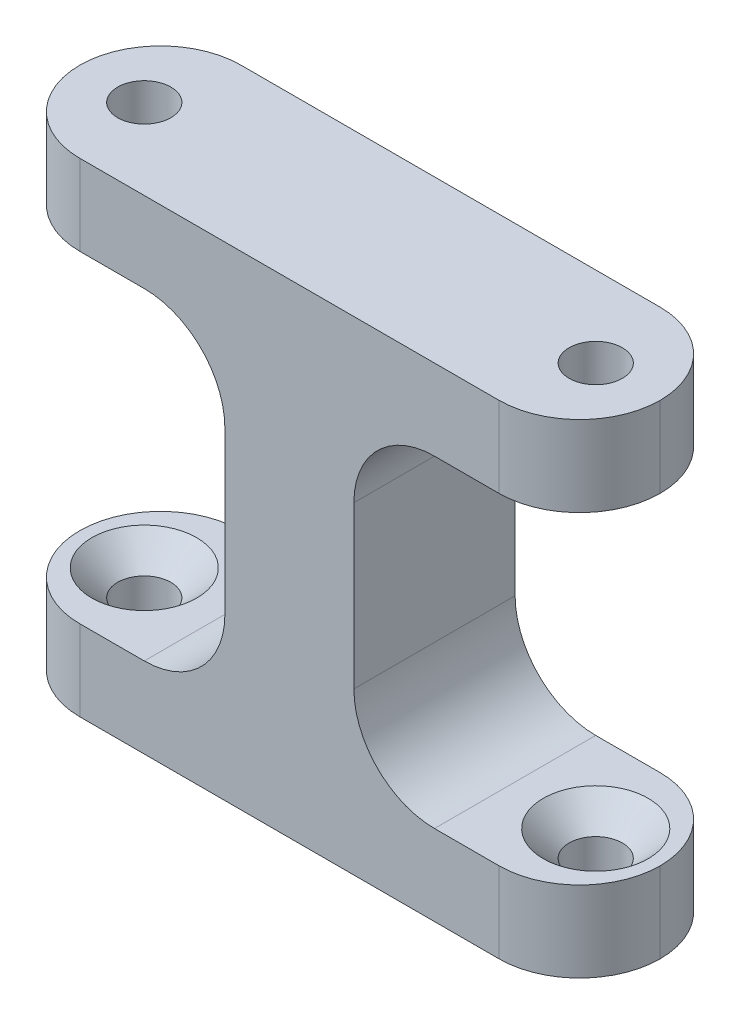
ISO-10303-21;
HEADER;
FILE_DESCRIPTION(('STEP AP214'),'2;1');
FILE_NAME('part.step','',(''),(''),'','','');
FILE_SCHEMA(('AUTOMOTIVE_DESIGN { 1 0 10303 214 1 1 1 1 }'));
ENDSEC;
DATA;
#1=APPLICATION_CONTEXT('core data for automotive mechanical design processes');
#2=APPLICATION_PROTOCOL_DEFINITION('international standard','automotive_design',2000,#1);
#3=PRODUCT_CONTEXT('',#1,'mechanical');
#4=PRODUCT('Part','Part','',(#3));
#5=PRODUCT_RELATED_PRODUCT_CATEGORY('part','',(#4));
#6=PRODUCT_DEFINITION_FORMATION('','',#4);
#7=PRODUCT_DEFINITION_CONTEXT('part definition',#1,'design');
#8=PRODUCT_DEFINITION('design','',#6,#7);
#9=PRODUCT_DEFINITION_SHAPE('','',#8);
#10=(LENGTH_UNIT() NAMED_UNIT(*) SI_UNIT(.MILLI.,.METRE.));
#11=(NAMED_UNIT(*) PLANE_ANGLE_UNIT() SI_UNIT($,.RADIAN.));
#12=(NAMED_UNIT(*) SI_UNIT($,.STERADIAN.) SOLID_ANGLE_UNIT());
#13=UNCERTAINTY_MEASURE_WITH_UNIT(LENGTH_MEASURE(1.E-05),#10,'distance_accuracy_value','');
#14=(GEOMETRIC_REPRESENTATION_CONTEXT(3) GLOBAL_UNCERTAINTY_ASSIGNED_CONTEXT((#13)) GLOBAL_UNIT_ASSIGNED_CONTEXT((#10,
#11,#12)) REPRESENTATION_CONTEXT('',''));
#15=CARTESIAN_POINT('',(0.,0.,0.));
#16=DIRECTION('',(0.,0.,1.));
#17=DIRECTION('',(1.,0.,0.));
#18=AXIS2_PLACEMENT_3D('',#15,#16,#17);
#19=CARTESIAN_POINT('',(-36.,0.,10.));
#20=DIRECTION('',(0.,1.,0.));
#21=DIRECTION('',(0.,0.,1.));
#22=AXIS2_PLACEMENT_3D('',#19,#20,#21);
#23=PLANE('',#22);
#24=CARTESIAN_POINT('',(-32.,0.,5.00000000000001));
#25=DIRECTION('',(0.,1.,0.));
#26=DIRECTION('',(-1.,0.,0.));
#27=AXIS2_PLACEMENT_3D('',#24,#25,#26);
#28=CIRCLE('',#27,1.65);
#29=CARTESIAN_POINT('',(-33.65,0.,5.00000000000001));
#30=VERTEX_POINT('',#29);
#31=EDGE_CURVE('E384',#30,#30,#28,.T.);
#32=ORIENTED_EDGE('',*,*,#31,.T.);
#33=EDGE_LOOP('',(#32));
#34=FACE_BOUND('',#33,.T.);
#35=CARTESIAN_POINT('',(-3.99999999999999,0.,5.00000000000001));
#36=DIRECTION('',(0.,1.,0.));
#37=DIRECTION('',(-1.,0.,0.));
#38=AXIS2_PLACEMENT_3D('',#35,#36,#37);
#39=CIRCLE('',#38,1.65);
#40=CARTESIAN_POINT('',(-5.64999999999999,0.,5.00000000000001));
#41=VERTEX_POINT('',#40);
#42=EDGE_CURVE('E319',#41,#41,#39,.T.);
#43=ORIENTED_EDGE('',*,*,#42,.T.);
#44=EDGE_LOOP('',(#43));
#45=FACE_BOUND('',#44,.T.);
#46=DIRECTION('',(1.,0.,0.));
#47=VECTOR('',#46,1.);
#48=CARTESIAN_POINT('',(-36.,0.,0.));
#49=LINE('',#48,#47);
#50=CARTESIAN_POINT('',(-31.,0.,0.));
#51=VERTEX_POINT('',#50);
#52=CARTESIAN_POINT('',(-5.,0.,0.));
#53=VERTEX_POINT('',#52);
#54=EDGE_CURVE('E355',#51,#53,#49,.T.);
#55=ORIENTED_EDGE('',*,*,#54,.T.);
#56=CARTESIAN_POINT('',(-5.,0.,5.));
#57=DIRECTION('',(0.,1.,0.));
#58=DIRECTION('',(0.,0.,1.));
#59=AXIS2_PLACEMENT_3D('',#56,#57,#58);
#60=CIRCLE('',#59,5.);
#61=CARTESIAN_POINT('',(0.,0.,5.));
#62=VERTEX_POINT('',#61);
#63=EDGE_CURVE('E310',#53,#62,#60,.F.);
#64=ORIENTED_EDGE('',*,*,#63,.T.);
#65=CARTESIAN_POINT('',(-5.,0.,5.));
#66=DIRECTION('',(0.,1.,0.));
#67=DIRECTION('',(0.,0.,1.));
#68=AXIS2_PLACEMENT_3D('',#65,#66,#67);
#69=CIRCLE('',#68,5.);
#70=CARTESIAN_POINT('',(-5.,0.,10.));
#71=VERTEX_POINT('',#70);
#72=EDGE_CURVE('E308',#62,#71,#69,.F.);
#73=ORIENTED_EDGE('',*,*,#72,.T.);
#74=DIRECTION('',(1.,0.,0.));
#75=VECTOR('',#74,1.);
#76=CARTESIAN_POINT('',(-36.,0.,10.));
#77=LINE('',#76,#75);
#78=CARTESIAN_POINT('',(-31.,0.,10.));
#79=VERTEX_POINT('',#78);
#80=EDGE_CURVE('E220',#79,#71,#77,.T.);
#81=ORIENTED_EDGE('',*,*,#80,.F.);
#82=CARTESIAN_POINT('',(-31.,0.,5.));
#83=DIRECTION('',(0.,1.,0.));
#84=DIRECTION('',(0.,0.,1.));
#85=AXIS2_PLACEMENT_3D('',#82,#83,#84);
#86=CIRCLE('',#85,5.);
#87=CARTESIAN_POINT('',(-36.,0.,5.));
#88=VERTEX_POINT('',#87);
#89=EDGE_CURVE('E304',#79,#88,#86,.F.);
#90=ORIENTED_EDGE('',*,*,#89,.T.);
#91=CARTESIAN_POINT('',(-31.,0.,5.));
#92=DIRECTION('',(0.,1.,0.));
#93=DIRECTION('',(0.,0.,1.));
#94=AXIS2_PLACEMENT_3D('',#91,#92,#93);
#95=CIRCLE('',#94,5.);
#96=EDGE_CURVE('E306',#88,#51,#95,.F.);
#97=ORIENTED_EDGE('',*,*,#96,.T.);
#98=EDGE_LOOP('',(#55,#64,#73,#81,#90,#97));
#99=FACE_BOUND('',#98,.T.);
#100=ADVANCED_FACE('F38',(#34,#45,#99),#23,.F.);
#101=CARTESIAN_POINT('',(0.,5.00000000000001,10.));
#102=DIRECTION('',(0.,-1.,0.));
#103=DIRECTION('',(1.,0.,0.));
#104=AXIS2_PLACEMENT_3D('',#101,#102,#103);
#105=PLANE('',#104);
#106=CARTESIAN_POINT('',(-3.99999999999999,5.00000000000001,5.00000000000001));
#107=DIRECTION('',(0.,-1.,0.));
#108=DIRECTION('',(1.,0.,0.));
#109=AXIS2_PLACEMENT_3D('',#106,#107,#108);
#110=CIRCLE('',#109,3.25000000000001);
#111=CARTESIAN_POINT('',(-3.99999999999999,5.00000000000001,8.25000000000002));
#112=VERTEX_POINT('',#111);
#113=EDGE_CURVE('E233',#112,#112,#110,.T.);
#114=ORIENTED_EDGE('',*,*,#113,.T.);
#115=EDGE_LOOP('',(#114));
#116=FACE_BOUND('',#115,.T.);
#117=CARTESIAN_POINT('',(-5.,5.00000000000001,5.));
#118=DIRECTION('',(0.,-1.,0.));
#119=DIRECTION('',(1.,0.,0.));
#120=AXIS2_PLACEMENT_3D('',#117,#118,#119);
#121=CIRCLE('',#120,5.);
#122=CARTESIAN_POINT('',(-5.,5.00000000000001,10.));
#123=VERTEX_POINT('',#122);
#124=CARTESIAN_POINT('',(0.,5.00000000000001,5.));
#125=VERTEX_POINT('',#124);
#126=EDGE_CURVE('E300',#123,#125,#121,.F.);
#127=ORIENTED_EDGE('',*,*,#126,.T.);
#128=CARTESIAN_POINT('',(-5.,5.00000000000001,5.));
#129=DIRECTION('',(0.,-1.,0.));
#130=DIRECTION('',(1.,0.,0.));
#131=AXIS2_PLACEMENT_3D('',#128,#129,#130);
#132=CIRCLE('',#131,5.);
#133=CARTESIAN_POINT('',(-5.,5.00000000000001,0.));
#134=VERTEX_POINT('',#133);
#135=EDGE_CURVE('E302',#125,#134,#132,.F.);
#136=ORIENTED_EDGE('',*,*,#135,.T.);
#137=DIRECTION('',(-1.,0.,0.));
#138=VECTOR('',#137,1.);
#139=CARTESIAN_POINT('',(0.,5.00000000000001,0.));
#140=LINE('',#139,#138);
#141=CARTESIAN_POINT('',(-8.99999999999999,5.,0.));
#142=VERTEX_POINT('',#141);
#143=EDGE_CURVE('E210',#134,#142,#140,.T.);
#144=ORIENTED_EDGE('',*,*,#143,.T.);
#145=DIRECTION('',(0.,0.,-1.));
#146=VECTOR('',#145,1.);
#147=CARTESIAN_POINT('',(-8.99999999999999,5.,10.));
#148=LINE('',#147,#146);
#149=CARTESIAN_POINT('',(-8.99999999999999,5.,10.));
#150=VERTEX_POINT('',#149);
#151=EDGE_CURVE('E187',#142,#150,#148,.F.);
#152=ORIENTED_EDGE('',*,*,#151,.T.);
#153=DIRECTION('',(-1.,0.,0.));
#154=VECTOR('',#153,1.);
#155=CARTESIAN_POINT('',(0.,5.00000000000001,10.));
#156=LINE('',#155,#154);
#157=EDGE_CURVE('E370',#123,#150,#156,.T.);
#158=ORIENTED_EDGE('',*,*,#157,.F.);
#159=EDGE_LOOP('',(#127,#136,#144,#152,#158));
#160=FACE_BOUND('',#159,.T.);
#161=ADVANCED_FACE('F359',(#116,#160),#105,.F.);
#162=CARTESIAN_POINT('',(-14.,5.,10.));
#163=DIRECTION('',(-1.,0.,0.));
#164=DIRECTION('',(0.,-1.,0.));
#165=AXIS2_PLACEMENT_3D('',#162,#163,#164);
#166=PLANE('',#165);
#167=DIRECTION('',(0.,1.,0.));
#168=VECTOR('',#167,1.);
#169=CARTESIAN_POINT('',(-14.,5.,0.));
#170=LINE('',#169,#168);
#171=CARTESIAN_POINT('',(-14.,10.,0.));
#172=VERTEX_POINT('',#171);
#173=CARTESIAN_POINT('',(-14.,20.,0.));
#174=VERTEX_POINT('',#173);
#175=EDGE_CURVE('E205',#172,#174,#170,.T.);
#176=ORIENTED_EDGE('',*,*,#175,.T.);
#177=DIRECTION('',(0.,0.,-1.));
#178=VECTOR('',#177,1.);
#179=CARTESIAN_POINT('',(-14.,20.,10.));
#180=LINE('',#179,#178);
#181=CARTESIAN_POINT('',(-14.,20.,10.));
#182=VERTEX_POINT('',#181);
#183=EDGE_CURVE('E181',#174,#182,#180,.F.);
#184=ORIENTED_EDGE('',*,*,#183,.T.);
#185=DIRECTION('',(0.,1.,0.));
#186=VECTOR('',#185,1.);
#187=CARTESIAN_POINT('',(-14.,5.,10.));
#188=LINE('',#187,#186);
#189=CARTESIAN_POINT('',(-14.,10.,10.));
#190=VERTEX_POINT('',#189);
#191=EDGE_CURVE('E347',#190,#182,#188,.T.);
#192=ORIENTED_EDGE('',*,*,#191,.F.);
#193=DIRECTION('',(0.,0.,-1.));
#194=VECTOR('',#193,1.);
#195=CARTESIAN_POINT('',(-14.,10.,0.));
#196=LINE('',#195,#194);
#197=EDGE_CURVE('E197',#190,#172,#196,.T.);
#198=ORIENTED_EDGE('',*,*,#197,.T.);
#199=EDGE_LOOP('',(#176,#184,#192,#198));
#200=FACE_BOUND('',#199,.T.);
#201=ADVANCED_FACE('F372',(#200),#166,.F.);
#202=CARTESIAN_POINT('',(-14.,25.,10.));
#203=DIRECTION('',(0.,1.,0.));
#204=DIRECTION('',(-1.,0.,0.));
#205=AXIS2_PLACEMENT_3D('',#202,#203,#204);
#206=PLANE('',#205);
#207=CARTESIAN_POINT('',(-4.,25.,5.00000000000001));
#208=DIRECTION('',(0.,1.,0.));
#209=DIRECTION('',(-1.,0.,0.));
#210=AXIS2_PLACEMENT_3D('',#207,#208,#209);
#211=CIRCLE('',#210,1.65);
#212=CARTESIAN_POINT('',(-5.65,25.,5.00000000000001));
#213=VERTEX_POINT('',#212);
#214=EDGE_CURVE('E224',#213,#213,#211,.T.);
#215=ORIENTED_EDGE('',*,*,#214,.T.);
#216=EDGE_LOOP('',(#215));
#217=FACE_BOUND('',#216,.T.);
#218=CARTESIAN_POINT('',(-5.,25.,5.));
#219=DIRECTION('',(0.,1.,0.));
#220=DIRECTION('',(-1.,0.,0.));
#221=AXIS2_PLACEMENT_3D('',#218,#219,#220);
#222=CIRCLE('',#221,5.);
#223=CARTESIAN_POINT('',(-5.,25.,0.));
#224=VERTEX_POINT('',#223);
#225=CARTESIAN_POINT('',(0.,25.,5.));
#226=VERTEX_POINT('',#225);
#227=EDGE_CURVE('E286',#224,#226,#222,.F.);
#228=ORIENTED_EDGE('',*,*,#227,.T.);
#229=CARTESIAN_POINT('',(-5.,25.,5.));
#230=DIRECTION('',(0.,1.,0.));
#231=DIRECTION('',(-1.,0.,0.));
#232=AXIS2_PLACEMENT_3D('',#229,#230,#231);
#233=CIRCLE('',#232,5.);
#234=CARTESIAN_POINT('',(-5.,25.,10.));
#235=VERTEX_POINT('',#234);
#236=EDGE_CURVE('E288',#226,#235,#233,.F.);
#237=ORIENTED_EDGE('',*,*,#236,.T.);
#238=DIRECTION('',(1.,0.,0.));
#239=VECTOR('',#238,1.);
#240=CARTESIAN_POINT('',(-14.,25.,10.));
#241=LINE('',#240,#239);
#242=CARTESIAN_POINT('',(-9.,25.,10.));
#243=VERTEX_POINT('',#242);
#244=EDGE_CURVE('E196',#243,#235,#241,.T.);
#245=ORIENTED_EDGE('',*,*,#244,.F.);
#246=DIRECTION('',(0.,0.,-1.));
#247=VECTOR('',#246,1.);
#248=CARTESIAN_POINT('',(-9.,25.,0.));
#249=LINE('',#248,#247);
#250=CARTESIAN_POINT('',(-9.,25.,0.));
#251=VERTEX_POINT('',#250);
#252=EDGE_CURVE('E180',#243,#251,#249,.T.);
#253=ORIENTED_EDGE('',*,*,#252,.T.);
#254=DIRECTION('',(1.,0.,0.));
#255=VECTOR('',#254,1.);
#256=CARTESIAN_POINT('',(-14.,25.,0.));
#257=LINE('',#256,#255);
#258=EDGE_CURVE('E193',#251,#224,#257,.T.);
#259=ORIENTED_EDGE('',*,*,#258,.T.);
#260=EDGE_LOOP('',(#228,#237,#245,#253,#259));
#261=FACE_BOUND('',#260,.T.);
#262=ADVANCED_FACE('F192',(#217,#261),#206,.F.);
#263=CARTESIAN_POINT('',(0.,30.,10.));
#264=DIRECTION('',(0.,-1.,0.));
#265=DIRECTION('',(1.,0.,0.));
#266=AXIS2_PLACEMENT_3D('',#263,#264,#265);
#267=PLANE('',#266);
#268=CARTESIAN_POINT('',(-32.,30.,5.00000000000001));
#269=DIRECTION('',(0.,-1.,0.));
#270=DIRECTION('',(1.,0.,0.));
#271=AXIS2_PLACEMENT_3D('',#268,#269,#270);
#272=CIRCLE('',#271,1.65);
#273=CARTESIAN_POINT('',(-30.35,30.,5.00000000000001));
#274=VERTEX_POINT('',#273);
#275=EDGE_CURVE('E225',#274,#274,#272,.T.);
#276=ORIENTED_EDGE('',*,*,#275,.T.);
#277=EDGE_LOOP('',(#276));
#278=FACE_BOUND('',#277,.T.);
#279=CARTESIAN_POINT('',(-4.,30.,5.00000000000001));
#280=DIRECTION('',(0.,-1.,0.));
#281=DIRECTION('',(1.,0.,0.));
#282=AXIS2_PLACEMENT_3D('',#279,#280,#281);
#283=CIRCLE('',#282,1.65);
#284=CARTESIAN_POINT('',(-2.35,30.,5.00000000000001));
#285=VERTEX_POINT('',#284);
#286=EDGE_CURVE('E221',#285,#285,#283,.T.);
#287=ORIENTED_EDGE('',*,*,#286,.T.);
#288=EDGE_LOOP('',(#287));
#289=FACE_BOUND('',#288,.T.);
#290=DIRECTION('',(-1.,0.,0.));
#291=VECTOR('',#290,1.);
#292=CARTESIAN_POINT('',(0.,30.,10.));
#293=LINE('',#292,#291);
#294=CARTESIAN_POINT('',(-5.,30.,10.));
#295=VERTEX_POINT('',#294);
#296=CARTESIAN_POINT('',(-31.,30.,10.));
#297=VERTEX_POINT('',#296);
#298=EDGE_CURVE('E339',#295,#297,#293,.T.);
#299=ORIENTED_EDGE('',*,*,#298,.F.);
#300=CARTESIAN_POINT('',(-5.,30.,5.));
#301=DIRECTION('',(0.,-1.,0.));
#302=DIRECTION('',(1.,0.,0.));
#303=AXIS2_PLACEMENT_3D('',#300,#301,#302);
#304=CIRCLE('',#303,5.);
#305=CARTESIAN_POINT('',(0.,30.,5.));
#306=VERTEX_POINT('',#305);
#307=EDGE_CURVE('E284',#295,#306,#304,.F.);
#308=ORIENTED_EDGE('',*,*,#307,.T.);
#309=CARTESIAN_POINT('',(-5.,30.,5.));
#310=DIRECTION('',(0.,-1.,0.));
#311=DIRECTION('',(1.,0.,0.));
#312=AXIS2_PLACEMENT_3D('',#309,#310,#311);
#313=CIRCLE('',#312,5.);
#314=CARTESIAN_POINT('',(-5.,30.,0.));
#315=VERTEX_POINT('',#314);
#316=EDGE_CURVE('E282',#306,#315,#313,.F.);
#317=ORIENTED_EDGE('',*,*,#316,.T.);
#318=DIRECTION('',(-1.,0.,0.));
#319=VECTOR('',#318,1.);
#320=CARTESIAN_POINT('',(0.,30.,0.));
#321=LINE('',#320,#319);
#322=CARTESIAN_POINT('',(-31.,30.,0.));
#323=VERTEX_POINT('',#322);
#324=EDGE_CURVE('E204',#315,#323,#321,.T.);
#325=ORIENTED_EDGE('',*,*,#324,.T.);
#326=CARTESIAN_POINT('',(-31.,30.,5.));
#327=DIRECTION('',(0.,-1.,0.));
#328=DIRECTION('',(1.,0.,0.));
#329=AXIS2_PLACEMENT_3D('',#326,#327,#328);
#330=CIRCLE('',#329,5.);
#331=CARTESIAN_POINT('',(-36.,30.,5.));
#332=VERTEX_POINT('',#331);
#333=EDGE_CURVE('E280',#323,#332,#330,.F.);
#334=ORIENTED_EDGE('',*,*,#333,.T.);
#335=CARTESIAN_POINT('',(-31.,30.,5.));
#336=DIRECTION('',(0.,-1.,0.));
#337=DIRECTION('',(1.,0.,0.));
#338=AXIS2_PLACEMENT_3D('',#335,#336,#337);
#339=CIRCLE('',#338,5.);
#340=EDGE_CURVE('E278',#332,#297,#339,.F.);
#341=ORIENTED_EDGE('',*,*,#340,.T.);
#342=EDGE_LOOP('',(#299,#308,#317,#325,#334,#341));
#343=FACE_BOUND('',#342,.T.);
#344=ADVANCED_FACE('F338',(#278,#289,#343),#267,.F.);
#345=CARTESIAN_POINT('',(-36.,25.,10.));
#346=DIRECTION('',(0.,1.,0.));
#347=DIRECTION('',(-1.,0.,0.));
#348=AXIS2_PLACEMENT_3D('',#345,#346,#347);
#349=PLANE('',#348);
#350=CARTESIAN_POINT('',(-32.,25.,5.00000000000001));
#351=DIRECTION('',(0.,1.,0.));
#352=DIRECTION('',(-1.,0.,0.));
#353=AXIS2_PLACEMENT_3D('',#350,#351,#352);
#354=CIRCLE('',#353,1.65);
#355=CARTESIAN_POINT('',(-33.65,25.,5.00000000000001));
#356=VERTEX_POINT('',#355);
#357=EDGE_CURVE('E381',#356,#356,#354,.T.);
#358=ORIENTED_EDGE('',*,*,#357,.T.);
#359=EDGE_LOOP('',(#358));
#360=FACE_BOUND('',#359,.T.);
#361=CARTESIAN_POINT('',(-31.,25.,5.));
#362=DIRECTION('',(0.,1.,0.));
#363=DIRECTION('',(-1.,0.,0.));
#364=AXIS2_PLACEMENT_3D('',#361,#362,#363);
#365=CIRCLE('',#364,5.);
#366=CARTESIAN_POINT('',(-31.,25.,10.));
#367=VERTEX_POINT('',#366);
#368=CARTESIAN_POINT('',(-36.,25.,5.));
#369=VERTEX_POINT('',#368);
#370=EDGE_CURVE('E47',#367,#369,#365,.F.);
#371=ORIENTED_EDGE('',*,*,#370,.T.);
#372=CARTESIAN_POINT('',(-31.,25.,5.));
#373=DIRECTION('',(0.,1.,0.));
#374=DIRECTION('',(-1.,0.,0.));
#375=AXIS2_PLACEMENT_3D('',#372,#373,#374);
#376=CIRCLE('',#375,5.);
#377=CARTESIAN_POINT('',(-31.,25.,0.));
#378=VERTEX_POINT('',#377);
#379=EDGE_CURVE('E11',#369,#378,#376,.F.);
#380=ORIENTED_EDGE('',*,*,#379,.T.);
#381=DIRECTION('',(1.,0.,0.));
#382=VECTOR('',#381,1.);
#383=CARTESIAN_POINT('',(-36.,25.,0.));
#384=LINE('',#383,#382);
#385=CARTESIAN_POINT('',(-27.,25.,0.));
#386=VERTEX_POINT('',#385);
#387=EDGE_CURVE('E208',#378,#386,#384,.T.);
#388=ORIENTED_EDGE('',*,*,#387,.T.);
#389=DIRECTION('',(0.,0.,-1.));
#390=VECTOR('',#389,1.);
#391=CARTESIAN_POINT('',(-27.,25.,10.));
#392=LINE('',#391,#390);
#393=CARTESIAN_POINT('',(-27.,25.,10.));
#394=VERTEX_POINT('',#393);
#395=EDGE_CURVE('E246',#386,#394,#392,.F.);
#396=ORIENTED_EDGE('',*,*,#395,.T.);
#397=DIRECTION('',(1.,0.,0.));
#398=VECTOR('',#397,1.);
#399=CARTESIAN_POINT('',(-36.,25.,10.));
#400=LINE('',#399,#398);
#401=EDGE_CURVE('E343',#367,#394,#400,.T.);
#402=ORIENTED_EDGE('',*,*,#401,.F.);
#403=EDGE_LOOP('',(#371,#380,#388,#396,#402));
#404=FACE_BOUND('',#403,.T.);
#405=ADVANCED_FACE('F605',(#360,#404),#349,.F.);
#406=CARTESIAN_POINT('',(-22.,25.,10.));
#407=DIRECTION('',(1.,0.,0.));
#408=DIRECTION('',(0.,1.,0.));
#409=AXIS2_PLACEMENT_3D('',#406,#407,#408);
#410=PLANE('',#409);
#411=DIRECTION('',(0.,-1.,0.));
#412=VECTOR('',#411,1.);
#413=CARTESIAN_POINT('',(-22.,25.,10.));
#414=LINE('',#413,#412);
#415=CARTESIAN_POINT('',(-22.,20.,10.));
#416=VERTEX_POINT('',#415);
#417=CARTESIAN_POINT('',(-22.,10.,10.));
#418=VERTEX_POINT('',#417);
#419=EDGE_CURVE('E345',#416,#418,#414,.T.);
#420=ORIENTED_EDGE('',*,*,#419,.F.);
#421=DIRECTION('',(0.,0.,-1.));
#422=VECTOR('',#421,1.);
#423=CARTESIAN_POINT('',(-22.,20.,0.));
#424=LINE('',#423,#422);
#425=CARTESIAN_POINT('',(-22.,20.,0.));
#426=VERTEX_POINT('',#425);
#427=EDGE_CURVE('E243',#416,#426,#424,.T.);
#428=ORIENTED_EDGE('',*,*,#427,.T.);
#429=DIRECTION('',(0.,-1.,0.));
#430=VECTOR('',#429,1.);
#431=CARTESIAN_POINT('',(-22.,25.,0.));
#432=LINE('',#431,#430);
#433=CARTESIAN_POINT('',(-22.,10.,0.));
#434=VERTEX_POINT('',#433);
#435=EDGE_CURVE('E215',#426,#434,#432,.T.);
#436=ORIENTED_EDGE('',*,*,#435,.T.);
#437=DIRECTION('',(0.,0.,-1.));
#438=VECTOR('',#437,1.);
#439=CARTESIAN_POINT('',(-22.,10.,10.));
#440=LINE('',#439,#438);
#441=EDGE_CURVE('E241',#434,#418,#440,.F.);
#442=ORIENTED_EDGE('',*,*,#441,.T.);
#443=EDGE_LOOP('',(#420,#428,#436,#442));
#444=FACE_BOUND('',#443,.T.);
#445=ADVANCED_FACE('F596',(#444),#410,.F.);
#446=CARTESIAN_POINT('',(-22.,5.,10.));
#447=DIRECTION('',(0.,-1.,0.));
#448=DIRECTION('',(1.,0.,0.));
#449=AXIS2_PLACEMENT_3D('',#446,#447,#448);
#450=PLANE('',#449);
#451=CARTESIAN_POINT('',(-32.,5.,5.00000000000001));
#452=DIRECTION('',(0.,-1.,0.));
#453=DIRECTION('',(1.,0.,0.));
#454=AXIS2_PLACEMENT_3D('',#451,#452,#453);
#455=CIRCLE('',#454,3.25);
#456=CARTESIAN_POINT('',(-28.75,5.,5.00000000000001));
#457=VERTEX_POINT('',#456);
#458=EDGE_CURVE('E226',#457,#457,#455,.T.);
#459=ORIENTED_EDGE('',*,*,#458,.T.);
#460=EDGE_LOOP('',(#459));
#461=FACE_BOUND('',#460,.T.);
#462=DIRECTION('',(-1.,0.,0.));
#463=VECTOR('',#462,1.);
#464=CARTESIAN_POINT('',(-22.,5.,0.));
#465=LINE('',#464,#463);
#466=CARTESIAN_POINT('',(-27.,5.,0.));
#467=VERTEX_POINT('',#466);
#468=CARTESIAN_POINT('',(-31.,5.,0.));
#469=VERTEX_POINT('',#468);
#470=EDGE_CURVE('E218',#467,#469,#465,.T.);
#471=ORIENTED_EDGE('',*,*,#470,.T.);
#472=CARTESIAN_POINT('',(-31.,5.,5.));
#473=DIRECTION('',(0.,-1.,0.));
#474=DIRECTION('',(1.,0.,0.));
#475=AXIS2_PLACEMENT_3D('',#472,#473,#474);
#476=CIRCLE('',#475,5.);
#477=CARTESIAN_POINT('',(-36.,5.,5.));
#478=VERTEX_POINT('',#477);
#479=EDGE_CURVE('E61',#469,#478,#476,.F.);
#480=ORIENTED_EDGE('',*,*,#479,.T.);
#481=CARTESIAN_POINT('',(-31.,5.,5.));
#482=DIRECTION('',(0.,-1.,0.));
#483=DIRECTION('',(1.,0.,0.));
#484=AXIS2_PLACEMENT_3D('',#481,#482,#483);
#485=CIRCLE('',#484,5.);
#486=CARTESIAN_POINT('',(-31.,5.,10.));
#487=VERTEX_POINT('',#486);
#488=EDGE_CURVE('E312',#478,#487,#485,.F.);
#489=ORIENTED_EDGE('',*,*,#488,.T.);
#490=DIRECTION('',(-1.,0.,0.));
#491=VECTOR('',#490,1.);
#492=CARTESIAN_POINT('',(-22.,5.,10.));
#493=LINE('',#492,#491);
#494=CARTESIAN_POINT('',(-27.,5.,10.));
#495=VERTEX_POINT('',#494);
#496=EDGE_CURVE('E230',#495,#487,#493,.T.);
#497=ORIENTED_EDGE('',*,*,#496,.F.);
#498=DIRECTION('',(0.,0.,-1.));
#499=VECTOR('',#498,1.);
#500=CARTESIAN_POINT('',(-27.,5.,0.));
#501=LINE('',#500,#499);
#502=EDGE_CURVE('E249',#495,#467,#501,.T.);
#503=ORIENTED_EDGE('',*,*,#502,.T.);
#504=EDGE_LOOP('',(#471,#480,#489,#497,#503));
#505=FACE_BOUND('',#504,.T.);
#506=ADVANCED_FACE('F588',(#461,#505),#450,.F.);
#507=CARTESIAN_POINT('',(0.,0.,10.));
#508=DIRECTION('',(0.,0.,1.));
#509=DIRECTION('',(1.,0.,0.));
#510=AXIS2_PLACEMENT_3D('',#507,#508,#509);
#511=PLANE('',#510);
#512=ORIENTED_EDGE('',*,*,#244,.T.);
#513=DIRECTION('',(0.,1.,0.));
#514=VECTOR('',#513,1.);
#515=CARTESIAN_POINT('',(-5.,30.,10.));
#516=LINE('',#515,#514);
#517=EDGE_CURVE('E275',#235,#295,#516,.T.);
#518=ORIENTED_EDGE('',*,*,#517,.T.);
#519=ORIENTED_EDGE('',*,*,#298,.T.);
#520=DIRECTION('',(0.,-1.,0.));
#521=VECTOR('',#520,1.);
#522=CARTESIAN_POINT('',(-31.,25.,10.));
#523=LINE('',#522,#521);
#524=EDGE_CURVE('E269',#297,#367,#523,.T.);
#525=ORIENTED_EDGE('',*,*,#524,.T.);
#526=ORIENTED_EDGE('',*,*,#401,.T.);
#527=CARTESIAN_POINT('',(-27.,20.,10.));
#528=DIRECTION('',(0.,0.,1.));
#529=DIRECTION('',(1.,0.,0.));
#530=AXIS2_PLACEMENT_3D('',#527,#528,#529);
#531=CIRCLE('',#530,5.);
#532=EDGE_CURVE('E258',#394,#416,#531,.F.);
#533=ORIENTED_EDGE('',*,*,#532,.T.);
#534=ORIENTED_EDGE('',*,*,#419,.T.);
#535=CARTESIAN_POINT('',(-27.,10.,10.));
#536=DIRECTION('',(0.,0.,1.));
#537=DIRECTION('',(1.,0.,0.));
#538=AXIS2_PLACEMENT_3D('',#535,#536,#537);
#539=CIRCLE('',#538,5.);
#540=EDGE_CURVE('E262',#418,#495,#539,.F.);
#541=ORIENTED_EDGE('',*,*,#540,.T.);
#542=ORIENTED_EDGE('',*,*,#496,.T.);
#543=DIRECTION('',(0.,-1.,0.));
#544=VECTOR('',#543,1.);
#545=CARTESIAN_POINT('',(-31.,0.,10.));
#546=LINE('',#545,#544);
#547=EDGE_CURVE('E271',#487,#79,#546,.T.);
#548=ORIENTED_EDGE('',*,*,#547,.T.);
#549=ORIENTED_EDGE('',*,*,#80,.T.);
#550=DIRECTION('',(0.,1.,0.));
#551=VECTOR('',#550,1.);
#552=CARTESIAN_POINT('',(-5.,5.00000000000001,10.));
#553=LINE('',#552,#551);
#554=EDGE_CURVE('E273',#71,#123,#553,.T.);
#555=ORIENTED_EDGE('',*,*,#554,.T.);
#556=ORIENTED_EDGE('',*,*,#157,.T.);
#557=CARTESIAN_POINT('',(-9.,10.,10.));
#558=DIRECTION('',(0.,0.,1.));
#559=DIRECTION('',(1.,0.,0.));
#560=AXIS2_PLACEMENT_3D('',#557,#558,#559);
#561=CIRCLE('',#560,5.);
#562=EDGE_CURVE('E267',#150,#190,#561,.F.);
#563=ORIENTED_EDGE('',*,*,#562,.T.);
#564=ORIENTED_EDGE('',*,*,#191,.T.);
#565=CARTESIAN_POINT('',(-9.,20.,10.));
#566=DIRECTION('',(0.,0.,1.));
#567=DIRECTION('',(1.,0.,0.));
#568=AXIS2_PLACEMENT_3D('',#565,#566,#567);
#569=CIRCLE('',#568,5.);
#570=EDGE_CURVE('E186',#182,#243,#569,.F.);
#571=ORIENTED_EDGE('',*,*,#570,.T.);
#572=EDGE_LOOP('',(#512,#518,#519,#525,#526,#533,#534,#541,#542,#548,#549,#555,#556,#563,#564,#571));
#573=FACE_BOUND('',#572,.T.);
#574=ADVANCED_FACE('F341',(#573),#511,.T.);
#575=CARTESIAN_POINT('',(0.,0.,0.));
#576=DIRECTION('',(0.,0.,1.));
#577=DIRECTION('',(1.,0.,0.));
#578=AXIS2_PLACEMENT_3D('',#575,#576,#577);
#579=PLANE('',#578);
#580=ORIENTED_EDGE('',*,*,#324,.F.);
#581=DIRECTION('',(0.,1.,0.));
#582=VECTOR('',#581,1.);
#583=CARTESIAN_POINT('',(-5.,0.,0.));
#584=LINE('',#583,#582);
#585=EDGE_CURVE('E203',#315,#224,#584,.F.);
#586=ORIENTED_EDGE('',*,*,#585,.T.);
#587=ORIENTED_EDGE('',*,*,#258,.F.);
#588=CARTESIAN_POINT('',(-9.,20.,0.));
#589=DIRECTION('',(0.,0.,1.));
#590=DIRECTION('',(1.,0.,0.));
#591=AXIS2_PLACEMENT_3D('',#588,#589,#590);
#592=CIRCLE('',#591,5.);
#593=EDGE_CURVE('E176',#251,#174,#592,.T.);
#594=ORIENTED_EDGE('',*,*,#593,.T.);
#595=ORIENTED_EDGE('',*,*,#175,.F.);
#596=CARTESIAN_POINT('',(-9.,10.,0.));
#597=DIRECTION('',(0.,0.,1.));
#598=DIRECTION('',(1.,0.,0.));
#599=AXIS2_PLACEMENT_3D('',#596,#597,#598);
#600=CIRCLE('',#599,5.);
#601=EDGE_CURVE('E264',#172,#142,#600,.T.);
#602=ORIENTED_EDGE('',*,*,#601,.T.);
#603=ORIENTED_EDGE('',*,*,#143,.F.);
#604=DIRECTION('',(0.,1.,0.));
#605=VECTOR('',#604,1.);
#606=CARTESIAN_POINT('',(-5.,0.,0.));
#607=LINE('',#606,#605);
#608=EDGE_CURVE('E296',#134,#53,#607,.F.);
#609=ORIENTED_EDGE('',*,*,#608,.T.);
#610=ORIENTED_EDGE('',*,*,#54,.F.);
#611=DIRECTION('',(0.,-1.,0.));
#612=VECTOR('',#611,1.);
#613=CARTESIAN_POINT('',(-31.,0.,0.));
#614=LINE('',#613,#612);
#615=EDGE_CURVE('E293',#51,#469,#614,.F.);
#616=ORIENTED_EDGE('',*,*,#615,.T.);
#617=ORIENTED_EDGE('',*,*,#470,.F.);
#618=CARTESIAN_POINT('',(-27.,10.,0.));
#619=DIRECTION('',(0.,0.,1.));
#620=DIRECTION('',(1.,0.,0.));
#621=AXIS2_PLACEMENT_3D('',#618,#619,#620);
#622=CIRCLE('',#621,5.);
#623=EDGE_CURVE('E260',#467,#434,#622,.T.);
#624=ORIENTED_EDGE('',*,*,#623,.T.);
#625=ORIENTED_EDGE('',*,*,#435,.F.);
#626=CARTESIAN_POINT('',(-27.,20.,0.));
#627=DIRECTION('',(0.,0.,1.));
#628=DIRECTION('',(1.,0.,0.));
#629=AXIS2_PLACEMENT_3D('',#626,#627,#628);
#630=CIRCLE('',#629,5.);
#631=EDGE_CURVE('E255',#426,#386,#630,.T.);
#632=ORIENTED_EDGE('',*,*,#631,.T.);
#633=ORIENTED_EDGE('',*,*,#387,.F.);
#634=DIRECTION('',(0.,-1.,0.));
#635=VECTOR('',#634,1.);
#636=CARTESIAN_POINT('',(-31.,0.,0.));
#637=LINE('',#636,#635);
#638=EDGE_CURVE('E290',#378,#323,#637,.F.);
#639=ORIENTED_EDGE('',*,*,#638,.T.);
#640=EDGE_LOOP('',(#580,#586,#587,#594,#595,#602,#603,#609,#610,#616,#617,#624,#625,#632,#633,#639));
#641=FACE_BOUND('',#640,.T.);
#642=ADVANCED_FACE('F201',(#641),#579,.F.);
#643=CARTESIAN_POINT('',(-32.,0.,5.00000000000001));
#644=DIRECTION('',(0.,1.,0.));
#645=DIRECTION('',(-1.,0.,0.));
#646=AXIS2_PLACEMENT_3D('',#643,#644,#645);
#647=CYLINDRICAL_SURFACE('',#646,1.65);
#648=CARTESIAN_POINT('',(-32.,3.39999999999998,5.00000000000001));
#649=DIRECTION('',(0.,-1.,0.));
#650=DIRECTION('',(0.,0.,-1.));
#651=AXIS2_PLACEMENT_3D('',#648,#649,#650);
#652=CIRCLE('',#651,1.65);
#653=CARTESIAN_POINT('',(-32.,3.39999999999998,3.35));
#654=VERTEX_POINT('',#653);
#655=EDGE_CURVE('E229',#654,#654,#652,.F.);
#656=ORIENTED_EDGE('',*,*,#655,.T.);
#657=EDGE_LOOP('',(#656));
#658=FACE_BOUND('',#657,.T.);
#659=ORIENTED_EDGE('',*,*,#31,.F.);
#660=EDGE_LOOP('',(#659));
#661=FACE_BOUND('',#660,.T.);
#662=ADVANCED_FACE('F392',(#658,#661),#647,.F.);
#663=ORIENTED_EDGE('',*,*,#357,.F.);
#664=EDGE_LOOP('',(#663));
#665=FACE_BOUND('',#664,.T.);
#666=ORIENTED_EDGE('',*,*,#275,.F.);
#667=EDGE_LOOP('',(#666));
#668=FACE_BOUND('',#667,.T.);
#669=ADVANCED_FACE('F394',(#665,#668),#647,.F.);
#670=CARTESIAN_POINT('',(-3.99999999999999,0.,5.00000000000001));
#671=DIRECTION('',(0.,1.,0.));
#672=DIRECTION('',(-1.,0.,0.));
#673=AXIS2_PLACEMENT_3D('',#670,#671,#672);
#674=CYLINDRICAL_SURFACE('',#673,1.65);
#675=ORIENTED_EDGE('',*,*,#286,.F.);
#676=EDGE_LOOP('',(#675));
#677=FACE_BOUND('',#676,.T.);
#678=ORIENTED_EDGE('',*,*,#214,.F.);
#679=EDGE_LOOP('',(#678));
#680=FACE_BOUND('',#679,.T.);
#681=ADVANCED_FACE('F401',(#677,#680),#674,.F.);
#682=CARTESIAN_POINT('',(-3.99999999999999,3.39999999999999,5.00000000000001));
#683=DIRECTION('',(0.,-1.,0.));
#684=DIRECTION('',(0.,0.,-1.));
#685=AXIS2_PLACEMENT_3D('',#682,#683,#684);
#686=CIRCLE('',#685,1.65);
#687=CARTESIAN_POINT('',(-3.99999999999999,3.39999999999999,6.65000000000001));
#688=VERTEX_POINT('',#687);
#689=EDGE_CURVE('E198',#688,#688,#686,.F.);
#690=ORIENTED_EDGE('',*,*,#689,.T.);
#691=EDGE_LOOP('',(#690));
#692=FACE_BOUND('',#691,.T.);
#693=ORIENTED_EDGE('',*,*,#42,.F.);
#694=EDGE_LOOP('',(#693));
#695=FACE_BOUND('',#694,.T.);
#696=ADVANCED_FACE('F422',(#692,#695),#674,.F.);
#697=CARTESIAN_POINT('',(-32.,5.,5.00000000000001));
#698=DIRECTION('',(0.,1.,0.));
#699=DIRECTION('',(0.,0.,1.));
#700=AXIS2_PLACEMENT_3D('',#697,#698,#699);
#701=CONICAL_SURFACE('',#700,3.25,0.785398163397444);
#702=ORIENTED_EDGE('',*,*,#655,.F.);
#703=EDGE_LOOP('',(#702));
#704=FACE_BOUND('',#703,.T.);
#705=ORIENTED_EDGE('',*,*,#458,.F.);
#706=EDGE_LOOP('',(#705));
#707=FACE_BOUND('',#706,.T.);
#708=ADVANCED_FACE('F415',(#704,#707),#701,.F.);
#709=CARTESIAN_POINT('',(-3.99999999999999,5.00000000000001,5.00000000000001));
#710=DIRECTION('',(0.,1.,0.));
#711=DIRECTION('',(0.,0.,1.));
#712=AXIS2_PLACEMENT_3D('',#709,#710,#711);
#713=CONICAL_SURFACE('',#712,3.25000000000001,0.785398163397445);
#714=CARTESIAN_POINT('',(-3.99999999999999,3.39999999999999,6.65000000000001));
#715=CARTESIAN_POINT('',(-3.99999999999999,3.41666666666665,6.66666666666667));
#716=CARTESIAN_POINT('',(-3.99999999999999,3.43333333333332,6.68333333333334));
#717=CARTESIAN_POINT('',(-3.99999999999999,3.46666666666665,6.71666666666667));
#718=CARTESIAN_POINT('',(-3.99999999999999,3.48333333333332,6.73333333333334));
#719=CARTESIAN_POINT('',(-3.99999999999999,3.51666666666666,6.76666666666667));
#720=CARTESIAN_POINT('',(-3.99999999999999,3.53333333333332,6.78333333333334));
#721=CARTESIAN_POINT('',(-3.99999999999999,3.56666666666666,6.81666666666667));
#722=CARTESIAN_POINT('',(-3.99999999999999,3.58333333333332,6.83333333333334));
#723=CARTESIAN_POINT('',(-3.99999999999999,3.61666666666666,6.86666666666668));
#724=CARTESIAN_POINT('',(-3.99999999999999,3.63333333333332,6.88333333333334));
#725=CARTESIAN_POINT('',(-3.99999999999999,3.66666666666666,6.91666666666667));
#726=CARTESIAN_POINT('',(-3.99999999999999,3.68333333333332,6.93333333333334));
#727=CARTESIAN_POINT('',(-3.99999999999999,3.71666666666666,6.96666666666668));
#728=CARTESIAN_POINT('',(-3.99999999999999,3.73333333333332,6.98333333333334));
#729=CARTESIAN_POINT('',(-3.99999999999999,3.76666666666666,7.01666666666668));
#730=CARTESIAN_POINT('',(-3.99999999999999,3.78333333333332,7.03333333333334));
#731=CARTESIAN_POINT('',(-3.99999999999999,3.81666666666666,7.06666666666668));
#732=CARTESIAN_POINT('',(-3.99999999999999,3.83333333333333,7.08333333333334));
#733=CARTESIAN_POINT('',(-3.99999999999999,3.86666666666666,7.11666666666668));
#734=CARTESIAN_POINT('',(-3.99999999999999,3.88333333333333,7.13333333333334));
#735=CARTESIAN_POINT('',(-3.99999999999999,3.91666666666666,7.16666666666668));
#736=CARTESIAN_POINT('',(-3.99999999999999,3.93333333333333,7.18333333333334));
#737=CARTESIAN_POINT('',(-3.99999999999999,3.96666666666666,7.21666666666668));
#738=CARTESIAN_POINT('',(-3.99999999999999,3.98333333333333,7.23333333333334));
#739=CARTESIAN_POINT('',(-3.99999999999999,4.01666666666666,7.26666666666668));
#740=CARTESIAN_POINT('',(-3.99999999999999,4.03333333333333,7.28333333333334));
#741=CARTESIAN_POINT('',(-3.99999999999999,4.06666666666666,7.31666666666668));
#742=CARTESIAN_POINT('',(-3.99999999999999,4.08333333333333,7.33333333333334));
#743=CARTESIAN_POINT('',(-3.99999999999999,4.11666666666666,7.36666666666668));
#744=CARTESIAN_POINT('',(-3.99999999999999,4.13333333333333,7.38333333333334));
#745=CARTESIAN_POINT('',(-3.99999999999999,4.16666666666666,7.41666666666668));
#746=CARTESIAN_POINT('',(-3.99999999999999,4.18333333333333,7.43333333333335));
#747=CARTESIAN_POINT('',(-3.99999999999999,4.21666666666666,7.46666666666668));
#748=CARTESIAN_POINT('',(-3.99999999999999,4.23333333333333,7.48333333333334));
#749=CARTESIAN_POINT('',(-3.99999999999999,4.26666666666666,7.51666666666668));
#750=CARTESIAN_POINT('',(-3.99999999999999,4.28333333333333,7.53333333333334));
#751=CARTESIAN_POINT('',(-3.99999999999999,4.31666666666666,7.56666666666668));
#752=CARTESIAN_POINT('',(-3.99999999999999,4.33333333333333,7.58333333333335));
#753=CARTESIAN_POINT('',(-3.99999999999999,4.36666666666667,7.61666666666668));
#754=CARTESIAN_POINT('',(-3.99999999999999,4.38333333333333,7.63333333333335));
#755=CARTESIAN_POINT('',(-3.99999999999999,4.41666666666667,7.66666666666668));
#756=CARTESIAN_POINT('',(-3.99999999999999,4.43333333333333,7.68333333333335));
#757=CARTESIAN_POINT('',(-3.99999999999999,4.46666666666667,7.71666666666668));
#758=CARTESIAN_POINT('',(-3.99999999999999,4.48333333333333,7.73333333333335));
#759=CARTESIAN_POINT('',(-3.99999999999999,4.51666666666667,7.76666666666668));
#760=CARTESIAN_POINT('',(-3.99999999999999,4.53333333333333,7.78333333333335));
#761=CARTESIAN_POINT('',(-3.99999999999999,4.56666666666667,7.81666666666668));
#762=CARTESIAN_POINT('',(-3.99999999999999,4.58333333333333,7.83333333333335));
#763=CARTESIAN_POINT('',(-3.99999999999999,4.61666666666667,7.86666666666668));
#764=CARTESIAN_POINT('',(-3.99999999999999,4.63333333333334,7.88333333333335));
#765=CARTESIAN_POINT('',(-3.99999999999999,4.66666666666667,7.91666666666668));
#766=CARTESIAN_POINT('',(-3.99999999999999,4.68333333333334,7.93333333333335));
#767=CARTESIAN_POINT('',(-3.99999999999999,4.71666666666667,7.96666666666668));
#768=CARTESIAN_POINT('',(-3.99999999999999,4.73333333333334,7.98333333333335));
#769=CARTESIAN_POINT('',(-3.99999999999999,4.76666666666667,8.01666666666668));
#770=CARTESIAN_POINT('',(-3.99999999999999,4.78333333333334,8.03333333333335));
#771=CARTESIAN_POINT('',(-3.99999999999999,4.81666666666667,8.06666666666668));
#772=CARTESIAN_POINT('',(-3.99999999999999,4.83333333333334,8.08333333333335));
#773=CARTESIAN_POINT('',(-3.99999999999999,4.86666666666667,8.11666666666668));
#774=CARTESIAN_POINT('',(-3.99999999999999,4.88333333333334,8.13333333333335));
#775=CARTESIAN_POINT('',(-3.99999999999999,4.91666666666667,8.16666666666668));
#776=CARTESIAN_POINT('',(-3.99999999999999,4.93333333333334,8.18333333333335));
#777=CARTESIAN_POINT('',(-3.99999999999999,4.96666666666667,8.21666666666668));
#778=CARTESIAN_POINT('',(-3.99999999999999,4.98333333333334,8.23333333333335));
#779=CARTESIAN_POINT('',(-3.99999999999999,5.00000000000001,8.25000000000002));
#780=B_SPLINE_CURVE_WITH_KNOTS('',3,(#714,#715,#716,#717,#718,#719,#720,#721,#722,#723,#724,
#725,#726,#727,#728,#729,#730,#731,#732,#733,#734,#735,#736,#737,#738,#739,#740,#741,#742,#743,
#744,#745,#746,#747,#748,#749,#750,#751,#752,#753,#754,#755,#756,#757,#758,#759,#760,#761,#762,
#763,#764,#765,#766,#767,#768,#769,#770,#771,#772,#773,#774,#775,#776,#777,#778,#779),
.UNSPECIFIED.,.F.,.F.,(4,2,2,2,2,2,2,2,2,2,2,2,2,2,2,2,2,2,2,2,2,2,2,2,2,2,2,2,2,2,2,2,4),(0.,
0.0707106781186556,0.141421356237311,0.212132034355966,0.282842712474622,0.353553390593277,
0.424264068711932,0.494974746830588,0.565685424949243,0.636396103067898,0.707106781186553,
0.777817459305209,0.848528137423864,0.919238815542519,0.989949493661175,1.06066017177983,
1.13137084989849,1.20208152801714,1.2727922061358,1.34350288425445,1.41421356237311,
1.48492424049176,1.55563491861042,1.62634559672907,1.69705627484773,1.76776695296638,
1.83847763108504,1.90918830920369,1.97989898732235,2.050609665441,2.12132034355966,
2.19203102167832,2.26274169979697),.UNSPECIFIED.);
#781=EDGE_CURVE('BSEAM421',#688,#112,#780,.T.);
#782=ORIENTED_EDGE('',*,*,#689,.F.);
#783=ORIENTED_EDGE('',*,*,#113,.F.);
#784=ORIENTED_EDGE('',*,*,#781,.T.);
#785=ORIENTED_EDGE('',*,*,#781,.F.);
#786=EDGE_LOOP('',(#782,#784,#783,#785));
#787=FACE_BOUND('',#786,.T.);
#788=ADVANCED_FACE('F421',(#787),#713,.F.);
#789=CARTESIAN_POINT('',(-9.,20.,10.));
#790=DIRECTION('',(0.,0.,1.));
#791=DIRECTION('',(1.,0.,0.));
#792=AXIS2_PLACEMENT_3D('',#789,#790,#791);
#793=CYLINDRICAL_SURFACE('',#792,5.);
#794=ORIENTED_EDGE('',*,*,#570,.F.);
#795=ORIENTED_EDGE('',*,*,#183,.F.);
#796=ORIENTED_EDGE('',*,*,#593,.F.);
#797=ORIENTED_EDGE('',*,*,#252,.F.);
#798=EDGE_LOOP('',(#794,#795,#796,#797));
#799=FACE_BOUND('',#798,.T.);
#800=ADVANCED_FACE('F179',(#799),#793,.F.);
#801=CARTESIAN_POINT('',(-27.,20.,10.));
#802=DIRECTION('',(0.,0.,1.));
#803=DIRECTION('',(1.,0.,0.));
#804=AXIS2_PLACEMENT_3D('',#801,#802,#803);
#805=CYLINDRICAL_SURFACE('',#804,5.);
#806=ORIENTED_EDGE('',*,*,#532,.F.);
#807=ORIENTED_EDGE('',*,*,#395,.F.);
#808=ORIENTED_EDGE('',*,*,#631,.F.);
#809=ORIENTED_EDGE('',*,*,#427,.F.);
#810=EDGE_LOOP('',(#806,#807,#808,#809));
#811=FACE_BOUND('',#810,.T.);
#812=ADVANCED_FACE('F431',(#811),#805,.F.);
#813=CARTESIAN_POINT('',(-27.,10.,10.));
#814=DIRECTION('',(0.,0.,1.));
#815=DIRECTION('',(1.,0.,0.));
#816=AXIS2_PLACEMENT_3D('',#813,#814,#815);
#817=CYLINDRICAL_SURFACE('',#816,5.);
#818=ORIENTED_EDGE('',*,*,#540,.F.);
#819=ORIENTED_EDGE('',*,*,#441,.F.);
#820=ORIENTED_EDGE('',*,*,#623,.F.);
#821=ORIENTED_EDGE('',*,*,#502,.F.);
#822=EDGE_LOOP('',(#818,#819,#820,#821));
#823=FACE_BOUND('',#822,.T.);
#824=ADVANCED_FACE('F434',(#823),#817,.F.);
#825=CARTESIAN_POINT('',(-9.,10.,10.));
#826=DIRECTION('',(0.,0.,1.));
#827=DIRECTION('',(1.,0.,0.));
#828=AXIS2_PLACEMENT_3D('',#825,#826,#827);
#829=CYLINDRICAL_SURFACE('',#828,5.);
#830=ORIENTED_EDGE('',*,*,#562,.F.);
#831=ORIENTED_EDGE('',*,*,#151,.F.);
#832=ORIENTED_EDGE('',*,*,#601,.F.);
#833=ORIENTED_EDGE('',*,*,#197,.F.);
#834=EDGE_LOOP('',(#830,#831,#832,#833));
#835=FACE_BOUND('',#834,.T.);
#836=ADVANCED_FACE('F367',(#835),#829,.F.);
#837=CARTESIAN_POINT('',(-5.,25.,5.));
#838=DIRECTION('',(0.,1.,0.));
#839=DIRECTION('',(0.,0.,1.));
#840=AXIS2_PLACEMENT_3D('',#837,#838,#839);
#841=CYLINDRICAL_SURFACE('',#840,5.);
#842=DIRECTION('',(0.,1.,0.));
#843=VECTOR('',#842,1.);
#844=CARTESIAN_POINT('',(0.,25.,5.));
#845=LINE('',#844,#843);
#846=EDGE_CURVE('E316',#226,#306,#845,.T.);
#847=ORIENTED_EDGE('',*,*,#846,.F.);
#848=ORIENTED_EDGE('',*,*,#227,.F.);
#849=ORIENTED_EDGE('',*,*,#585,.F.);
#850=ORIENTED_EDGE('',*,*,#316,.F.);
#851=EDGE_LOOP('',(#847,#848,#849,#850));
#852=FACE_BOUND('',#851,.T.);
#853=ADVANCED_FACE('F441',(#852),#841,.T.);
#854=CARTESIAN_POINT('',(-5.,0.,5.));
#855=DIRECTION('',(0.,-1.,0.));
#856=DIRECTION('',(0.,0.,-1.));
#857=AXIS2_PLACEMENT_3D('',#854,#855,#856);
#858=CYLINDRICAL_SURFACE('',#857,5.);
#859=ORIENTED_EDGE('',*,*,#236,.F.);
#860=ORIENTED_EDGE('',*,*,#846,.T.);
#861=ORIENTED_EDGE('',*,*,#307,.F.);
#862=ORIENTED_EDGE('',*,*,#517,.F.);
#863=EDGE_LOOP('',(#859,#860,#861,#862));
#864=FACE_BOUND('',#863,.T.);
#865=ADVANCED_FACE('F442',(#864),#858,.T.);
#866=CARTESIAN_POINT('',(-5.,0.,5.));
#867=DIRECTION('',(0.,-1.,0.));
#868=DIRECTION('',(1.,0.,0.));
#869=AXIS2_PLACEMENT_3D('',#866,#867,#868);
#870=CYLINDRICAL_SURFACE('',#869,5.);
#871=ORIENTED_EDGE('',*,*,#554,.F.);
#872=ORIENTED_EDGE('',*,*,#72,.F.);
#873=DIRECTION('',(0.,1.,0.));
#874=VECTOR('',#873,1.);
#875=CARTESIAN_POINT('',(0.,0.,5.));
#876=LINE('',#875,#874);
#877=EDGE_CURVE('E320',#125,#62,#876,.F.);
#878=ORIENTED_EDGE('',*,*,#877,.F.);
#879=ORIENTED_EDGE('',*,*,#126,.F.);
#880=EDGE_LOOP('',(#871,#872,#878,#879));
#881=FACE_BOUND('',#880,.T.);
#882=ADVANCED_FACE('F445',(#881),#870,.T.);
#883=CARTESIAN_POINT('',(-5.,0.,5.));
#884=DIRECTION('',(0.,1.,0.));
#885=DIRECTION('',(-1.,0.,0.));
#886=AXIS2_PLACEMENT_3D('',#883,#884,#885);
#887=CYLINDRICAL_SURFACE('',#886,5.);
#888=ORIENTED_EDGE('',*,*,#63,.F.);
#889=ORIENTED_EDGE('',*,*,#608,.F.);
#890=ORIENTED_EDGE('',*,*,#135,.F.);
#891=ORIENTED_EDGE('',*,*,#877,.T.);
#892=EDGE_LOOP('',(#888,#889,#890,#891));
#893=FACE_BOUND('',#892,.T.);
#894=ADVANCED_FACE('F450',(#893),#887,.T.);
#895=CARTESIAN_POINT('',(-31.,0.,5.));
#896=DIRECTION('',(0.,1.,0.));
#897=DIRECTION('',(0.,0.,1.));
#898=AXIS2_PLACEMENT_3D('',#895,#896,#897);
#899=CYLINDRICAL_SURFACE('',#898,5.);
#900=ORIENTED_EDGE('',*,*,#547,.F.);
#901=ORIENTED_EDGE('',*,*,#488,.F.);
#902=DIRECTION('',(0.,-1.,0.));
#903=VECTOR('',#902,1.);
#904=CARTESIAN_POINT('',(-36.,5.,5.));
#905=LINE('',#904,#903);
#906=EDGE_CURVE('E322',#88,#478,#905,.F.);
#907=ORIENTED_EDGE('',*,*,#906,.F.);
#908=ORIENTED_EDGE('',*,*,#89,.F.);
#909=EDGE_LOOP('',(#900,#901,#907,#908));
#910=FACE_BOUND('',#909,.T.);
#911=ADVANCED_FACE('F453',(#910),#899,.T.);
#912=CARTESIAN_POINT('',(-31.,5.,5.));
#913=DIRECTION('',(0.,-1.,0.));
#914=DIRECTION('',(0.,0.,-1.));
#915=AXIS2_PLACEMENT_3D('',#912,#913,#914);
#916=CYLINDRICAL_SURFACE('',#915,5.);
#917=ORIENTED_EDGE('',*,*,#479,.F.);
#918=ORIENTED_EDGE('',*,*,#615,.F.);
#919=ORIENTED_EDGE('',*,*,#96,.F.);
#920=ORIENTED_EDGE('',*,*,#906,.T.);
#921=EDGE_LOOP('',(#917,#918,#919,#920));
#922=FACE_BOUND('',#921,.T.);
#923=ADVANCED_FACE('F458',(#922),#916,.T.);
#924=CARTESIAN_POINT('',(-31.,0.,5.));
#925=DIRECTION('',(0.,1.,0.));
#926=DIRECTION('',(0.,0.,1.));
#927=AXIS2_PLACEMENT_3D('',#924,#925,#926);
#928=CYLINDRICAL_SURFACE('',#927,5.);
#929=ORIENTED_EDGE('',*,*,#524,.F.);
#930=ORIENTED_EDGE('',*,*,#340,.F.);
#931=DIRECTION('',(0.,-1.,0.));
#932=VECTOR('',#931,1.);
#933=CARTESIAN_POINT('',(-36.,30.,5.));
#934=LINE('',#933,#932);
#935=EDGE_CURVE('E42',#369,#332,#934,.F.);
#936=ORIENTED_EDGE('',*,*,#935,.F.);
#937=ORIENTED_EDGE('',*,*,#370,.F.);
#938=EDGE_LOOP('',(#929,#930,#936,#937));
#939=FACE_BOUND('',#938,.T.);
#940=ADVANCED_FACE('F40',(#939),#928,.T.);
#941=CARTESIAN_POINT('',(-31.,30.,5.));
#942=DIRECTION('',(0.,-1.,0.));
#943=DIRECTION('',(0.,0.,-1.));
#944=AXIS2_PLACEMENT_3D('',#941,#942,#943);
#945=CYLINDRICAL_SURFACE('',#944,5.);
#946=ORIENTED_EDGE('',*,*,#333,.F.);
#947=ORIENTED_EDGE('',*,*,#638,.F.);
#948=ORIENTED_EDGE('',*,*,#379,.F.);
#949=ORIENTED_EDGE('',*,*,#935,.T.);
#950=EDGE_LOOP('',(#946,#947,#948,#949));
#951=FACE_BOUND('',#950,.T.);
#952=ADVANCED_FACE('F330',(#951),#945,.T.);
#953=CLOSED_SHELL('',(#100,#161,#201,#262,#344,#405,#445,#506,#574,#642,#662,#669,#681,#696,
#708,#788,#800,#812,#824,#836,#853,#865,#882,#894,#911,#923,#940,#952));
#954=MANIFOLD_SOLID_BREP('B2',#953);
#955=ADVANCED_BREP_SHAPE_REPRESENTATION('',(#18,#954),#14);
#956=SHAPE_DEFINITION_REPRESENTATION(#9,#955);
ENDSEC;
END-ISO-10303-21;
